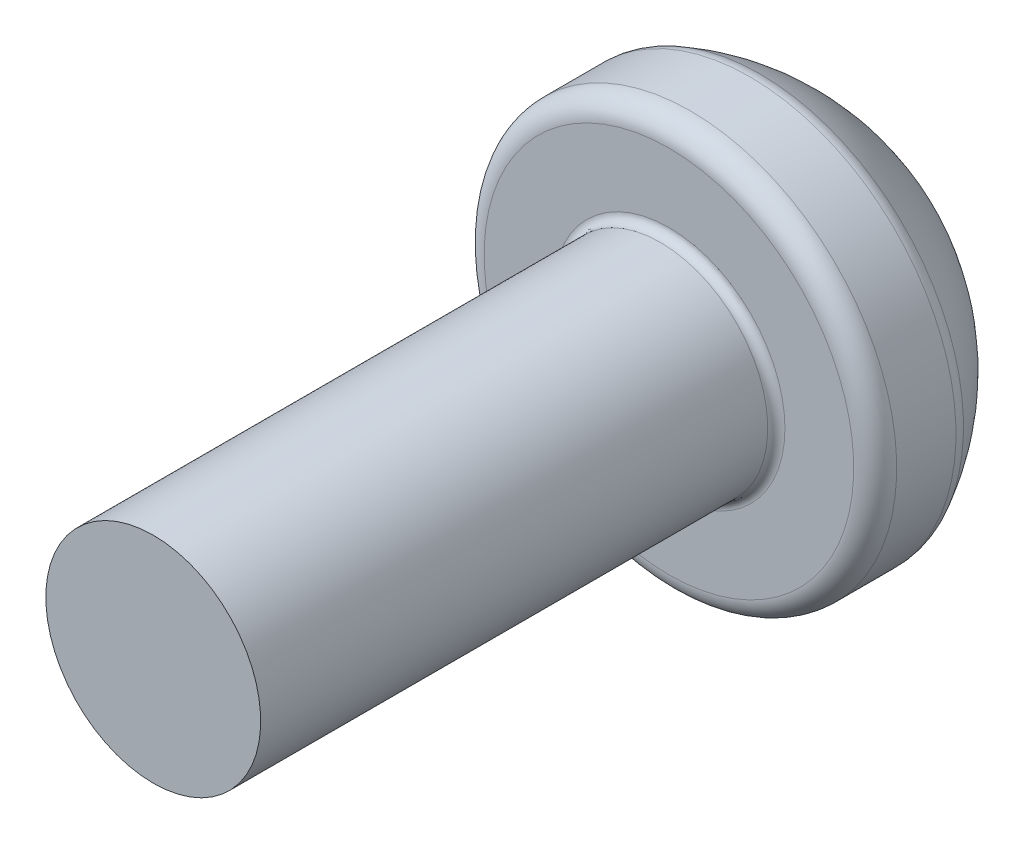
ISO-10303-21;
HEADER;
FILE_DESCRIPTION(('STEP AP214'),'2;1');
FILE_NAME('part.step','',(''),(''),'','','');
FILE_SCHEMA(('AUTOMOTIVE_DESIGN { 1 0 10303 214 1 1 1 1 }'));
ENDSEC;
DATA;
#1=APPLICATION_CONTEXT('core data for automotive mechanical design processes');
#2=APPLICATION_PROTOCOL_DEFINITION('international standard','automotive_design',2000,#1);
#3=PRODUCT_CONTEXT('',#1,'mechanical');
#4=PRODUCT('Part','Part','',(#3));
#5=PRODUCT_RELATED_PRODUCT_CATEGORY('part','',(#4));
#6=PRODUCT_DEFINITION_FORMATION('','',#4);
#7=PRODUCT_DEFINITION_CONTEXT('part definition',#1,'design');
#8=PRODUCT_DEFINITION('design','',#6,#7);
#9=PRODUCT_DEFINITION_SHAPE('','',#8);
#10=(LENGTH_UNIT() NAMED_UNIT(*) SI_UNIT(.MILLI.,.METRE.));
#11=(NAMED_UNIT(*) PLANE_ANGLE_UNIT() SI_UNIT($,.RADIAN.));
#12=(NAMED_UNIT(*) SI_UNIT($,.STERADIAN.) SOLID_ANGLE_UNIT());
#13=UNCERTAINTY_MEASURE_WITH_UNIT(LENGTH_MEASURE(1.E-05),#10,'distance_accuracy_value','');
#14=(GEOMETRIC_REPRESENTATION_CONTEXT(3) GLOBAL_UNCERTAINTY_ASSIGNED_CONTEXT((#13)) GLOBAL_UNIT_ASSIGNED_CONTEXT((#10,
#11,#12)) REPRESENTATION_CONTEXT('',''));
#15=CARTESIAN_POINT('',(0.,0.,0.));
#16=DIRECTION('',(0.,0.,1.));
#17=DIRECTION('',(1.,0.,0.));
#18=AXIS2_PLACEMENT_3D('',#15,#16,#17);
#19=CARTESIAN_POINT('',(0.,0.,6.));
#20=DIRECTION('',(0.,0.,1.));
#21=DIRECTION('',(0.,-1.,0.));
#22=AXIS2_PLACEMENT_3D('',#19,#20,#21);
#23=PLANE('',#22);
#24=CARTESIAN_POINT('',(0.,0.,6.));
#25=DIRECTION('',(0.,0.,-1.));
#26=DIRECTION('',(0.,1.,0.));
#27=AXIS2_PLACEMENT_3D('',#24,#25,#26);
#28=CIRCLE('',#27,1.25);
#29=CARTESIAN_POINT('',(0.,1.25000000000002,6.));
#30=VERTEX_POINT('',#29);
#31=EDGE_CURVE('E265',#30,#30,#28,.T.);
#32=ORIENTED_EDGE('',*,*,#31,.F.);
#33=EDGE_LOOP('',(#32));
#34=FACE_BOUND('',#33,.T.);
#35=ADVANCED_FACE('F34',(#34),#23,.T.);
#36=CARTESIAN_POINT('',(0.,0.,-1.99999999999999));
#37=DIRECTION('',(0.,0.,-1.));
#38=DIRECTION('',(0.,1.,0.));
#39=AXIS2_PLACEMENT_3D('',#36,#37,#38);
#40=CYLINDRICAL_SURFACE('',#39,1.25);
#41=CARTESIAN_POINT('',(0.,0.,0.1));
#42=DIRECTION('',(0.,0.,1.));
#43=DIRECTION('',(0.,-1.,0.));
#44=AXIS2_PLACEMENT_3D('',#41,#42,#43);
#45=CIRCLE('',#44,1.25);
#46=CARTESIAN_POINT('',(0.,-1.25000000000001,0.1));
#47=VERTEX_POINT('',#46);
#48=EDGE_CURVE('E271',#47,#47,#45,.T.);
#49=ORIENTED_EDGE('',*,*,#48,.T.);
#50=EDGE_LOOP('',(#49));
#51=FACE_BOUND('',#50,.T.);
#52=ORIENTED_EDGE('',*,*,#31,.T.);
#53=EDGE_LOOP('',(#52));
#54=FACE_BOUND('',#53,.T.);
#55=ADVANCED_FACE('F309',(#51,#54),#40,.T.);
#56=CARTESIAN_POINT('',(0.,1.25000000000001,0.));
#57=DIRECTION('',(0.,0.,1.));
#58=DIRECTION('',(0.,-1.,0.));
#59=AXIS2_PLACEMENT_3D('',#56,#57,#58);
#60=PLANE('',#59);
#61=CARTESIAN_POINT('',(0.,0.,0.));
#62=DIRECTION('',(0.,0.,1.));
#63=DIRECTION('',(0.,-1.,0.));
#64=AXIS2_PLACEMENT_3D('',#61,#62,#63);
#65=CIRCLE('',#64,2.15);
#66=CARTESIAN_POINT('',(0.,-2.15,0.));
#67=VERTEX_POINT('',#66);
#68=EDGE_CURVE('E11',#67,#67,#65,.T.);
#69=ORIENTED_EDGE('',*,*,#68,.T.);
#70=EDGE_LOOP('',(#69));
#71=FACE_BOUND('',#70,.T.);
#72=CARTESIAN_POINT('',(0.,0.,0.));
#73=DIRECTION('',(0.,0.,1.));
#74=DIRECTION('',(0.,-1.,0.));
#75=AXIS2_PLACEMENT_3D('',#72,#73,#74);
#76=CIRCLE('',#75,1.35);
#77=CARTESIAN_POINT('',(0.,-1.35,0.));
#78=VERTEX_POINT('',#77);
#79=EDGE_CURVE('E268',#78,#78,#76,.F.);
#80=ORIENTED_EDGE('',*,*,#79,.T.);
#81=EDGE_LOOP('',(#80));
#82=FACE_BOUND('',#81,.T.);
#83=ADVANCED_FACE('F315',(#71,#82),#60,.T.);
#84=CARTESIAN_POINT('',(0.,0.,-1.99999999999999));
#85=DIRECTION('',(0.,0.,-1.));
#86=DIRECTION('',(0.,1.,0.));
#87=AXIS2_PLACEMENT_3D('',#84,#85,#86);
#88=CYLINDRICAL_SURFACE('',#87,2.4);
#89=CARTESIAN_POINT('',(0.,0.,-0.939716779629664));
#90=DIRECTION('',(0.,0.,1.));
#91=DIRECTION('',(0.,-1.,0.));
#92=AXIS2_PLACEMENT_3D('',#89,#90,#91);
#93=CIRCLE('',#92,2.4);
#94=CARTESIAN_POINT('',(0.,-2.39999999999999,-0.939716779629664));
#95=VERTEX_POINT('',#94);
#96=EDGE_CURVE('E42',#95,#95,#93,.T.);
#97=ORIENTED_EDGE('',*,*,#96,.T.);
#98=EDGE_LOOP('',(#97));
#99=FACE_BOUND('',#98,.T.);
#100=CARTESIAN_POINT('',(0.,0.,-0.249999999999992));
#101=DIRECTION('',(0.,0.,1.));
#102=DIRECTION('',(0.,-1.,0.));
#103=AXIS2_PLACEMENT_3D('',#100,#101,#102);
#104=CIRCLE('',#103,2.4);
#105=CARTESIAN_POINT('',(0.,-2.4,-0.249999999999992));
#106=VERTEX_POINT('',#105);
#107=EDGE_CURVE('E277',#106,#106,#104,.F.);
#108=ORIENTED_EDGE('',*,*,#107,.T.);
#109=EDGE_LOOP('',(#108));
#110=FACE_BOUND('',#109,.T.);
#111=ADVANCED_FACE('F282',(#99,#110),#88,.T.);
#112=CARTESIAN_POINT('',(0.,0.,0.194199999999998));
#113=DIRECTION('',(0.,0.,-1.));
#114=DIRECTION('',(0.,1.,0.));
#115=AXIS2_PLACEMENT_3D('',#112,#113,#114);
#116=SPHERICAL_SURFACE('',#115,2.68069275374855);
#117=CARTESIAN_POINT('',(0.,0.,-1.05634163666692));
#118=DIRECTION('',(0.,0.,1.));
#119=DIRECTION('',(0.,-1.,0.));
#120=AXIS2_PLACEMENT_3D('',#117,#118,#119);
#121=CIRCLE('',#120,2.37113037493985);
#122=CARTESIAN_POINT('',(0.,2.37113037493985,-1.05634163666692));
#123=VERTEX_POINT('',#122);
#124=EDGE_CURVE('E274',#123,#123,#121,.F.);
#125=CARTESIAN_POINT('',(0.,0.,-1.99999999999999));
#126=DIRECTION('',(0.,0.,-1.));
#127=DIRECTION('',(0.,1.,0.));
#128=AXIS2_PLACEMENT_3D('',#125,#126,#127);
#129=CIRCLE('',#128,1.54);
#130=CARTESIAN_POINT('',(0.,1.54,-1.99999999999999));
#131=VERTEX_POINT('',#130);
#132=EDGE_CURVE('E261',#131,#131,#129,.T.);
#133=CARTESIAN_POINT('',(0.,2.37113037493985,-1.05634163666692));
#134=CARTESIAN_POINT('',(0.,2.36496233821131,-1.06803676094616));
#135=CARTESIAN_POINT('',(0.,2.35870776249117,-1.0796862440655));
#136=CARTESIAN_POINT('',(0.,2.34602693211457,-1.10289139359935));
#137=CARTESIAN_POINT('',(0.,2.33960067745811,-1.11444706001385));
#138=CARTESIAN_POINT('',(0.,2.32657788825569,-1.137462041753));
#139=CARTESIAN_POINT('',(0.,2.31998135370975,-1.14892135707765));
#140=CARTESIAN_POINT('',(0.,2.3066194511287,-1.1717411288514));
#141=CARTESIAN_POINT('',(0.,2.29985408309359,-1.1831015853005));
#142=CARTESIAN_POINT('',(0.,2.28615599420093,-1.20572115170728));
#143=CARTESIAN_POINT('',(0.,2.27922327334336,-1.21698026166495));
#144=CARTESIAN_POINT('',(0.,2.2651919968365,-1.23939467005739));
#145=CARTESIAN_POINT('',(0.,2.25809344118721,-1.25054996849214));
#146=CARTESIAN_POINT('',(0.,2.24373204924237,-1.27275431143024));
#147=CARTESIAN_POINT('',(0.,2.23646921294684,-1.28380335593359));
#148=CARTESIAN_POINT('',(0.,2.22178084987522,-1.30579277189245));
#149=CARTESIAN_POINT('',(0.,2.21435532309914,-1.31673314334796));
#150=CARTESIAN_POINT('',(0.,2.19934320483832,-1.33850281788041));
#151=CARTESIAN_POINT('',(0.,2.19175661335357,-1.34933212095736));
#152=CARTESIAN_POINT('',(0.,2.17642402671519,-1.37087728772175));
#153=CARTESIAN_POINT('',(0.,2.16867803156156,-1.3815931514092));
#154=CARTESIAN_POINT('',(0.,2.15302833352466,-1.40290909322001));
#155=CARTESIAN_POINT('',(0.,2.14512463064139,-1.41350917134337));
#156=CARTESIAN_POINT('',(0.,2.12916124761392,-1.43459122120211));
#157=CARTESIAN_POINT('',(0.,2.12110156746971,-1.44507319293749));
#158=CARTESIAN_POINT('',(0.,2.10482799453926,-1.46591673505503));
#159=CARTESIAN_POINT('',(0.,2.09661410175302,-1.47627830543719));
#160=CARTESIAN_POINT('',(0.,2.08003390192139,-1.49687877624421));
#161=CARTESIAN_POINT('',(0.,2.07166759487599,-1.50711767666908));
#162=CARTESIAN_POINT('',(0.,2.05478439827908,-1.52747056581531));
#163=CARTESIAN_POINT('',(0.,2.04626750872758,-1.53758455453666));
#164=CARTESIAN_POINT('',(0.,2.02908501184067,-1.55768540587833));
#165=CARTESIAN_POINT('',(0.,2.02041940450527,-1.56767226849863));
#166=CARTESIAN_POINT('',(0.,2.00294136933363,-1.58751668107414));
#167=CARTESIAN_POINT('',(0.,1.9941289414974,-1.59737423102935));
#168=CARTESIAN_POINT('',(0.,1.97635919475265,-1.61695786002287));
#169=CARTESIAN_POINT('',(0.,1.96740187584413,-1.62668393906117));
#170=CARTESIAN_POINT('',(0.,1.9493443081064,-1.64600249675386));
#171=CARTESIAN_POINT('',(0.,1.94024405927719,-1.65559497540823));
#172=CARTESIAN_POINT('',(0.,1.92190262414329,-1.67464423211702));
#173=CARTESIAN_POINT('',(0.,1.91266143783862,-1.68410101017144));
#174=CARTESIAN_POINT('',(0.,1.89404015105646,-1.70287679517513));
#175=CARTESIAN_POINT('',(0.,1.88466005057898,-1.71219580212441));
#176=CARTESIAN_POINT('',(0.,1.86576298916831,-1.7306940045768));
#177=CARTESIAN_POINT('',(0.,1.85624602823512,-1.73987320007991));
#178=CARTESIAN_POINT('',(0.,1.83707732959487,-1.7580897699098));
#179=CARTESIAN_POINT('',(0.,1.8274255918878,-1.76712714423657));
#180=CARTESIAN_POINT('',(0.,1.80798945289038,-1.78505809303471));
#181=CARTESIAN_POINT('',(0.,1.79820505160001,-1.79395166750609));
#182=CARTESIAN_POINT('',(0.,1.77850572767181,-1.81159306939759));
#183=CARTESIAN_POINT('',(0.,1.76859080503397,-1.82034089681773));
#184=CARTESIAN_POINT('',(0.,1.74863260922598,-1.8376888893248));
#185=CARTESIAN_POINT('',(0.,1.73858933605584,-1.84628905441173));
#186=CARTESIAN_POINT('',(0.,1.7183766380907,-1.8633398392874));
#187=CARTESIAN_POINT('',(0.,1.70820721329571,-1.87179045907613));
#188=CARTESIAN_POINT('',(0.,1.68774443864321,-1.88854030318034));
#189=CARTESIAN_POINT('',(0.,1.67745108878569,-1.89683952749583));
#190=CARTESIAN_POINT('',(0.,1.65674271757358,-1.91328476344681));
#191=CARTESIAN_POINT('',(0.,1.64632769621899,-1.92143077508231));
#192=CARTESIAN_POINT('',(0.,1.62537826270076,-1.93756780267901));
#193=CARTESIAN_POINT('',(0.,1.61484385053712,-1.94555881864021));
#194=CARTESIAN_POINT('',(0.,1.59365794042496,-1.96138410333854));
#195=CARTESIAN_POINT('',(0.,1.58300644247643,-1.96921837207567));
#196=CARTESIAN_POINT('',(0.,1.56158869818568,-1.98472845439087));
#197=CARTESIAN_POINT('',(0.,1.55082245184346,-1.99240426796895));
#198=CARTESIAN_POINT('',(0.,1.54,-1.99999999999999));
#199=B_SPLINE_CURVE_WITH_KNOTS('',3,(#133,#134,#135,#136,#137,#138,#139,#140,#141,#142,#143,
#144,#145,#146,#147,#148,#149,#150,#151,#152,#153,#154,#155,#156,#157,#158,#159,#160,#161,#162,
#163,#164,#165,#166,#167,#168,#169,#170,#171,#172,#173,#174,#175,#176,#177,#178,#179,#180,#181,
#182,#183,#184,#185,#186,#187,#188,#189,#190,#191,#192,#193,#194,#195,#196,#197,#198),
.UNSPECIFIED.,.F.,.F.,(4,2,2,2,2,2,2,2,2,2,2,2,2,2,2,2,2,2,2,2,2,2,2,2,2,2,2,2,2,2,2,2,4),(0.,
0.0396655612265228,0.0793311224530455,0.118996683679568,0.158662244906091,0.198327806132614,
0.237993367359137,0.277658928585659,0.317324489812182,0.356990051038705,0.396655612265228,
0.43632117349175,0.475986734718273,0.515652295944796,0.555317857171319,0.594983418397842,
0.634648979624364,0.674314540850887,0.71398010207741,0.753645663303933,0.793311224530455,
0.832976785756978,0.872642346983501,0.912307908210024,0.951973469436547,0.991639030663069,
1.03130459188959,1.07097015311612,1.11063571434264,1.15030127556916,1.18996683679568,
1.22963239802221,1.26929795924873),.UNSPECIFIED.);
#200=EDGE_CURVE('BSEAM291',#123,#131,#199,.T.);
#201=ORIENTED_EDGE('',*,*,#124,.T.);
#202=ORIENTED_EDGE('',*,*,#132,.F.);
#203=ORIENTED_EDGE('',*,*,#200,.T.);
#204=ORIENTED_EDGE('',*,*,#200,.F.);
#205=EDGE_LOOP('',(#201,#203,#202,#204));
#206=FACE_BOUND('',#205,.T.);
#207=ADVANCED_FACE('F291',(#206),#116,.T.);
#208=CARTESIAN_POINT('',(0.,0.,-1.99999999999999));
#209=DIRECTION('',(0.,0.,-1.));
#210=DIRECTION('',(0.,1.,0.));
#211=AXIS2_PLACEMENT_3D('',#208,#209,#210);
#212=PLANE('',#211);
#213=CARTESIAN_POINT('',(0.,0.,-1.99999999999999));
#214=DIRECTION('',(0.,0.,-1.));
#215=DIRECTION('',(0.,1.,0.));
#216=AXIS2_PLACEMENT_3D('',#213,#214,#215);
#217=CIRCLE('',#216,1.4);
#218=CARTESIAN_POINT('',(0.217707917147314,-1.38296900283822,-2.));
#219=VERTEX_POINT('',#218);
#220=CARTESIAN_POINT('',(-0.217707917147369,-1.38296900283822,-1.99999999999999));
#221=VERTEX_POINT('',#220);
#222=EDGE_CURVE('E220',#219,#221,#217,.T.);
#223=ORIENTED_EDGE('',*,*,#222,.F.);
#224=CARTESIAN_POINT('',(0.807499999999954,-1.39863102711187,-1.99999999999999));
#225=DIRECTION('',(0.,0.,1.));
#226=DIRECTION('',(0.,1.,0.));
#227=AXIS2_PLACEMENT_3D('',#224,#225,#226);
#228=CIRCLE('',#227,0.59);
#229=CARTESIAN_POINT('',(1.08883233053058,-0.880025088273745,-2.));
#230=VERTEX_POINT('',#229);
#231=EDGE_CURVE('E218',#230,#219,#228,.T.);
#232=ORIENTED_EDGE('',*,*,#231,.F.);
#233=CARTESIAN_POINT('',(0.,0.,-1.99999999999999));
#234=DIRECTION('',(0.,0.,-1.));
#235=DIRECTION('',(0.,1.,0.));
#236=AXIS2_PLACEMENT_3D('',#233,#234,#235);
#237=CIRCLE('',#236,1.4);
#238=CARTESIAN_POINT('',(1.30654024767795,-0.50294391456452,-1.99999999999999));
#239=VERTEX_POINT('',#238);
#240=EDGE_CURVE('E215',#239,#230,#237,.T.);
#241=ORIENTED_EDGE('',*,*,#240,.F.);
#242=CARTESIAN_POINT('',(1.61499999999998,0.,-1.99999999999999));
#243=DIRECTION('',(0.,0.,1.));
#244=DIRECTION('',(0.,1.,0.));
#245=AXIS2_PLACEMENT_3D('',#242,#243,#244);
#246=CIRCLE('',#245,0.59);
#247=CARTESIAN_POINT('',(1.30654024767796,0.502943914564482,-1.99999999999999));
#248=VERTEX_POINT('',#247);
#249=EDGE_CURVE('E213',#248,#239,#246,.T.);
#250=ORIENTED_EDGE('',*,*,#249,.F.);
#251=CARTESIAN_POINT('',(0.,0.,-1.99999999999999));
#252=DIRECTION('',(0.,0.,-1.));
#253=DIRECTION('',(0.,1.,0.));
#254=AXIS2_PLACEMENT_3D('',#251,#252,#253);
#255=CIRCLE('',#254,1.4);
#256=CARTESIAN_POINT('',(1.08883233053061,0.880025088273728,-2.));
#257=VERTEX_POINT('',#256);
#258=EDGE_CURVE('E210',#257,#248,#255,.T.);
#259=ORIENTED_EDGE('',*,*,#258,.F.);
#260=CARTESIAN_POINT('',(0.807499999999975,1.39863102711188,-2.));
#261=DIRECTION('',(0.,0.,1.));
#262=DIRECTION('',(0.,1.,0.));
#263=AXIS2_PLACEMENT_3D('',#260,#261,#262);
#264=CIRCLE('',#263,0.59);
#265=CARTESIAN_POINT('',(0.217707917147307,1.38296900283823,-2.));
#266=VERTEX_POINT('',#265);
#267=EDGE_CURVE('E208',#266,#257,#264,.T.);
#268=ORIENTED_EDGE('',*,*,#267,.F.);
#269=CARTESIAN_POINT('',(0.,0.,-1.99999999999999));
#270=DIRECTION('',(0.,0.,-1.));
#271=DIRECTION('',(0.,1.,0.));
#272=AXIS2_PLACEMENT_3D('',#269,#270,#271);
#273=CIRCLE('',#272,1.4);
#274=CARTESIAN_POINT('',(-0.21770791714739,1.38296900283822,-2.));
#275=VERTEX_POINT('',#274);
#276=EDGE_CURVE('E205',#275,#266,#273,.T.);
#277=ORIENTED_EDGE('',*,*,#276,.F.);
#278=CARTESIAN_POINT('',(-0.8075000000001,1.39863102711186,-2.));
#279=DIRECTION('',(0.,0.,1.));
#280=DIRECTION('',(0.,1.,0.));
#281=AXIS2_PLACEMENT_3D('',#278,#279,#280);
#282=CIRCLE('',#281,0.59);
#283=CARTESIAN_POINT('',(-1.08883233053075,0.880025088273707,-2.));
#284=VERTEX_POINT('',#283);
#285=EDGE_CURVE('E203',#284,#275,#282,.T.);
#286=ORIENTED_EDGE('',*,*,#285,.F.);
#287=CARTESIAN_POINT('',(0.,0.,-1.99999999999999));
#288=DIRECTION('',(0.,0.,-1.));
#289=DIRECTION('',(0.,1.,0.));
#290=AXIS2_PLACEMENT_3D('',#287,#288,#289);
#291=CIRCLE('',#290,1.4);
#292=CARTESIAN_POINT('',(-1.30654024767803,0.502943914564503,-2.));
#293=VERTEX_POINT('',#292);
#294=EDGE_CURVE('E201',#293,#284,#291,.T.);
#295=ORIENTED_EDGE('',*,*,#294,.F.);
#296=CARTESIAN_POINT('',(-1.61500000000011,0.,-2.));
#297=DIRECTION('',(0.,0.,1.));
#298=DIRECTION('',(0.,1.,0.));
#299=AXIS2_PLACEMENT_3D('',#296,#297,#298);
#300=CIRCLE('',#299,0.59);
#301=CARTESIAN_POINT('',(-1.30654024767804,-0.502943914564499,-1.99999999999999));
#302=VERTEX_POINT('',#301);
#303=EDGE_CURVE('E161',#302,#293,#300,.T.);
#304=ORIENTED_EDGE('',*,*,#303,.F.);
#305=CARTESIAN_POINT('',(0.,0.,-1.99999999999999));
#306=DIRECTION('',(0.,0.,-1.));
#307=DIRECTION('',(0.,1.,0.));
#308=AXIS2_PLACEMENT_3D('',#305,#306,#307);
#309=CIRCLE('',#308,1.4);
#310=CARTESIAN_POINT('',(-1.08883233053067,-0.880025088273732,-1.99999999999999));
#311=VERTEX_POINT('',#310);
#312=EDGE_CURVE('E157',#311,#302,#309,.T.);
#313=ORIENTED_EDGE('',*,*,#312,.F.);
#314=CARTESIAN_POINT('',(-0.807500000000044,-1.39863102711187,-2.));
#315=DIRECTION('',(0.,0.,1.));
#316=DIRECTION('',(0.,1.,0.));
#317=AXIS2_PLACEMENT_3D('',#314,#315,#316);
#318=CIRCLE('',#317,0.59);
#319=EDGE_CURVE('E223',#221,#311,#318,.T.);
#320=ORIENTED_EDGE('',*,*,#319,.F.);
#321=EDGE_LOOP('',(#223,#232,#241,#250,#259,#268,#277,#286,#295,#304,#313,#320));
#322=FACE_BOUND('',#321,.T.);
#323=ORIENTED_EDGE('',*,*,#132,.T.);
#324=EDGE_LOOP('',(#323));
#325=FACE_BOUND('',#324,.T.);
#326=ADVANCED_FACE('F294',(#322,#325),#212,.T.);
#327=CARTESIAN_POINT('',(0.,0.,0.1));
#328=DIRECTION('',(0.,0.,1.));
#329=DIRECTION('',(0.,-1.,0.));
#330=AXIS2_PLACEMENT_3D('',#327,#328,#329);
#331=TOROIDAL_SURFACE('',#330,1.35,0.1);
#332=ORIENTED_EDGE('',*,*,#48,.F.);
#333=EDGE_LOOP('',(#332));
#334=FACE_BOUND('',#333,.T.);
#335=ORIENTED_EDGE('',*,*,#79,.F.);
#336=EDGE_LOOP('',(#335));
#337=FACE_BOUND('',#336,.T.);
#338=ADVANCED_FACE('F288',(#334,#337),#331,.F.);
#339=CARTESIAN_POINT('',(0.,0.,-0.939716779629664));
#340=DIRECTION('',(0.,0.,1.));
#341=DIRECTION('',(0.,-1.,0.));
#342=AXIS2_PLACEMENT_3D('',#339,#340,#341);
#343=TOROIDAL_SURFACE('',#342,2.15,0.25);
#344=ORIENTED_EDGE('',*,*,#96,.F.);
#345=EDGE_LOOP('',(#344));
#346=FACE_BOUND('',#345,.T.);
#347=ORIENTED_EDGE('',*,*,#124,.F.);
#348=EDGE_LOOP('',(#347));
#349=FACE_BOUND('',#348,.T.);
#350=ADVANCED_FACE('F285',(#346,#349),#343,.T.);
#351=CARTESIAN_POINT('',(0.,0.,-0.249999999999992));
#352=DIRECTION('',(0.,0.,1.));
#353=DIRECTION('',(0.,-1.,0.));
#354=AXIS2_PLACEMENT_3D('',#351,#352,#353);
#355=TOROIDAL_SURFACE('',#354,2.15,0.25);
#356=ORIENTED_EDGE('',*,*,#68,.F.);
#357=EDGE_LOOP('',(#356));
#358=FACE_BOUND('',#357,.T.);
#359=ORIENTED_EDGE('',*,*,#107,.F.);
#360=EDGE_LOOP('',(#359));
#361=FACE_BOUND('',#360,.T.);
#362=ADVANCED_FACE('F36',(#358,#361),#355,.T.);
#363=CARTESIAN_POINT('',(-1.61500000000011,0.,-1.));
#364=DIRECTION('',(0.,0.,-1.));
#365=DIRECTION('',(0.,1.,0.));
#366=AXIS2_PLACEMENT_3D('',#363,#364,#365);
#367=CYLINDRICAL_SURFACE('',#366,0.59);
#368=CARTESIAN_POINT('',(-1.61500000000011,0.,-1.));
#369=DIRECTION('',(0.,0.,1.));
#370=DIRECTION('',(0.,1.,0.));
#371=AXIS2_PLACEMENT_3D('',#368,#369,#370);
#372=CIRCLE('',#371,0.59);
#373=CARTESIAN_POINT('',(-1.30654024767803,-0.502943914564503,-0.999999999999993));
#374=VERTEX_POINT('',#373);
#375=CARTESIAN_POINT('',(-1.025,0.,-0.999999999999993));
#376=VERTEX_POINT('',#375);
#377=EDGE_CURVE('E156',#374,#376,#372,.T.);
#378=ORIENTED_EDGE('',*,*,#377,.F.);
#379=DIRECTION('',(0.,0.,-1.));
#380=VECTOR('',#379,1.);
#381=CARTESIAN_POINT('',(-1.30654024767803,-0.502943914564503,-0.999999999999993));
#382=LINE('',#381,#380);
#383=EDGE_CURVE('E227',#374,#302,#382,.T.);
#384=ORIENTED_EDGE('',*,*,#383,.T.);
#385=ORIENTED_EDGE('',*,*,#303,.T.);
#386=DIRECTION('',(0.,0.,-1.));
#387=VECTOR('',#386,1.);
#388=CARTESIAN_POINT('',(-1.30654024767807,0.502943914564492,-1.));
#389=LINE('',#388,#387);
#390=CARTESIAN_POINT('',(-1.30654024767807,0.502943914564492,-1.));
#391=VERTEX_POINT('',#390);
#392=EDGE_CURVE('E49',#391,#293,#389,.T.);
#393=ORIENTED_EDGE('',*,*,#392,.F.);
#394=EDGE_CURVE('E147',#376,#391,#372,.T.);
#395=ORIENTED_EDGE('',*,*,#394,.F.);
#396=EDGE_LOOP('',(#378,#384,#385,#393,#395));
#397=FACE_BOUND('',#396,.T.);
#398=ADVANCED_FACE('F159',(#397),#367,.T.);
#399=CARTESIAN_POINT('',(-0.807500000000093,-1.39863102711188,-0.999999999999995));
#400=DIRECTION('',(0.,0.,-1.));
#401=DIRECTION('',(0.,1.,0.));
#402=AXIS2_PLACEMENT_3D('',#399,#400,#401);
#403=CYLINDRICAL_SURFACE('',#402,0.59);
#404=CARTESIAN_POINT('',(-0.807500000000093,-1.39863102711188,-0.999999999999995));
#405=DIRECTION('',(0.,0.,1.));
#406=DIRECTION('',(0.,1.,0.));
#407=AXIS2_PLACEMENT_3D('',#404,#405,#406);
#408=CIRCLE('',#407,0.59);
#409=CARTESIAN_POINT('',(-0.217707917147369,-1.38296900283823,-1.));
#410=VERTEX_POINT('',#409);
#411=CARTESIAN_POINT('',(-0.512500000000068,-0.887676038879067,-0.999999999999993));
#412=VERTEX_POINT('',#411);
#413=EDGE_CURVE('E195',#410,#412,#408,.T.);
#414=ORIENTED_EDGE('',*,*,#413,.F.);
#415=DIRECTION('',(0.,0.,-1.));
#416=VECTOR('',#415,1.);
#417=CARTESIAN_POINT('',(-0.217707917147369,-1.38296900283823,-1.));
#418=LINE('',#417,#416);
#419=EDGE_CURVE('E233',#410,#221,#418,.T.);
#420=ORIENTED_EDGE('',*,*,#419,.T.);
#421=ORIENTED_EDGE('',*,*,#319,.T.);
#422=DIRECTION('',(0.,0.,-1.));
#423=VECTOR('',#422,1.);
#424=CARTESIAN_POINT('',(-1.08883233053066,-0.880025088273732,-0.999999999999993));
#425=LINE('',#424,#423);
#426=CARTESIAN_POINT('',(-1.08883233053066,-0.880025088273732,-0.999999999999993));
#427=VERTEX_POINT('',#426);
#428=EDGE_CURVE('E230',#427,#311,#425,.T.);
#429=ORIENTED_EDGE('',*,*,#428,.F.);
#430=EDGE_CURVE('E194',#412,#427,#408,.T.);
#431=ORIENTED_EDGE('',*,*,#430,.F.);
#432=EDGE_LOOP('',(#414,#420,#421,#429,#431));
#433=FACE_BOUND('',#432,.T.);
#434=ADVANCED_FACE('F363',(#433),#403,.T.);
#435=CARTESIAN_POINT('',(0.80749999999994,-1.39863102711189,-0.999999999999993));
#436=DIRECTION('',(0.,0.,-1.));
#437=DIRECTION('',(0.,1.,0.));
#438=AXIS2_PLACEMENT_3D('',#435,#436,#437);
#439=CYLINDRICAL_SURFACE('',#438,0.59);
#440=CARTESIAN_POINT('',(0.80749999999994,-1.39863102711189,-0.999999999999993));
#441=DIRECTION('',(0.,0.,1.));
#442=DIRECTION('',(0.,1.,0.));
#443=AXIS2_PLACEMENT_3D('',#440,#441,#442);
#444=CIRCLE('',#443,0.59);
#445=CARTESIAN_POINT('',(1.08883233053058,-0.880025088273752,-1.));
#446=VERTEX_POINT('',#445);
#447=CARTESIAN_POINT('',(0.512499999999992,-0.88767603887906,-0.999999999999993));
#448=VERTEX_POINT('',#447);
#449=EDGE_CURVE('E188',#446,#448,#444,.T.);
#450=ORIENTED_EDGE('',*,*,#449,.F.);
#451=DIRECTION('',(0.,0.,-1.));
#452=VECTOR('',#451,1.);
#453=CARTESIAN_POINT('',(1.08883233053058,-0.880025088273752,-1.));
#454=LINE('',#453,#452);
#455=EDGE_CURVE('E239',#446,#230,#454,.T.);
#456=ORIENTED_EDGE('',*,*,#455,.T.);
#457=ORIENTED_EDGE('',*,*,#231,.T.);
#458=DIRECTION('',(0.,0.,-1.));
#459=VECTOR('',#458,1.);
#460=CARTESIAN_POINT('',(0.217707917147307,-1.38296900283823,-0.999999999999995));
#461=LINE('',#460,#459);
#462=CARTESIAN_POINT('',(0.217707917147307,-1.38296900283823,-0.999999999999995));
#463=VERTEX_POINT('',#462);
#464=EDGE_CURVE('E236',#463,#219,#461,.T.);
#465=ORIENTED_EDGE('',*,*,#464,.F.);
#466=EDGE_CURVE('E187',#448,#463,#444,.T.);
#467=ORIENTED_EDGE('',*,*,#466,.F.);
#468=EDGE_LOOP('',(#450,#456,#457,#465,#467));
#469=FACE_BOUND('',#468,.T.);
#470=ADVANCED_FACE('F370',(#469),#439,.T.);
#471=CARTESIAN_POINT('',(1.61499999999996,0.,-0.999999999999993));
#472=DIRECTION('',(0.,0.,-1.));
#473=DIRECTION('',(0.,1.,0.));
#474=AXIS2_PLACEMENT_3D('',#471,#472,#473);
#475=CYLINDRICAL_SURFACE('',#474,0.59);
#476=CARTESIAN_POINT('',(1.61499999999996,0.,-0.999999999999993));
#477=DIRECTION('',(0.,0.,1.));
#478=DIRECTION('',(0.,1.,0.));
#479=AXIS2_PLACEMENT_3D('',#476,#477,#478);
#480=CIRCLE('',#479,0.59);
#481=CARTESIAN_POINT('',(1.30654024767801,0.502943914564492,-0.999999999999993));
#482=VERTEX_POINT('',#481);
#483=CARTESIAN_POINT('',(1.02499999999998,0.,-0.999999999999993));
#484=VERTEX_POINT('',#483);
#485=EDGE_CURVE('E181',#482,#484,#480,.T.);
#486=ORIENTED_EDGE('',*,*,#485,.F.);
#487=DIRECTION('',(0.,0.,-1.));
#488=VECTOR('',#487,1.);
#489=CARTESIAN_POINT('',(1.30654024767801,0.502943914564492,-0.999999999999993));
#490=LINE('',#489,#488);
#491=EDGE_CURVE('E245',#482,#248,#490,.T.);
#492=ORIENTED_EDGE('',*,*,#491,.T.);
#493=ORIENTED_EDGE('',*,*,#249,.T.);
#494=DIRECTION('',(0.,0.,-1.));
#495=VECTOR('',#494,1.);
#496=CARTESIAN_POINT('',(1.30654024767796,-0.502943914564524,-0.999999999999993));
#497=LINE('',#496,#495);
#498=CARTESIAN_POINT('',(1.30654024767796,-0.502943914564524,-0.999999999999993));
#499=VERTEX_POINT('',#498);
#500=EDGE_CURVE('E242',#499,#239,#497,.T.);
#501=ORIENTED_EDGE('',*,*,#500,.F.);
#502=EDGE_CURVE('E180',#484,#499,#480,.T.);
#503=ORIENTED_EDGE('',*,*,#502,.F.);
#504=EDGE_LOOP('',(#486,#492,#493,#501,#503));
#505=FACE_BOUND('',#504,.T.);
#506=ADVANCED_FACE('F378',(#505),#475,.T.);
#507=CARTESIAN_POINT('',(0.807499999999989,1.39863102711188,-1.00000000000001));
#508=DIRECTION('',(0.,0.,-1.));
#509=DIRECTION('',(0.,1.,0.));
#510=AXIS2_PLACEMENT_3D('',#507,#508,#509);
#511=CYLINDRICAL_SURFACE('',#510,0.59);
#512=CARTESIAN_POINT('',(0.807499999999989,1.39863102711188,-1.00000000000001));
#513=DIRECTION('',(0.,0.,1.));
#514=DIRECTION('',(0.,1.,0.));
#515=AXIS2_PLACEMENT_3D('',#512,#513,#514);
#516=CIRCLE('',#515,0.59);
#517=CARTESIAN_POINT('',(0.217707917147342,1.38296900283823,-1.));
#518=VERTEX_POINT('',#517);
#519=CARTESIAN_POINT('',(0.512499999999978,0.88767603887905,-1.));
#520=VERTEX_POINT('',#519);
#521=EDGE_CURVE('E57',#518,#520,#516,.T.);
#522=ORIENTED_EDGE('',*,*,#521,.F.);
#523=DIRECTION('',(0.,0.,-1.));
#524=VECTOR('',#523,1.);
#525=CARTESIAN_POINT('',(0.217707917147342,1.38296900283823,-1.));
#526=LINE('',#525,#524);
#527=EDGE_CURVE('E251',#518,#266,#526,.T.);
#528=ORIENTED_EDGE('',*,*,#527,.T.);
#529=ORIENTED_EDGE('',*,*,#267,.T.);
#530=DIRECTION('',(0.,0.,-1.));
#531=VECTOR('',#530,1.);
#532=CARTESIAN_POINT('',(1.08883233053061,0.880025088273714,-1.));
#533=LINE('',#532,#531);
#534=CARTESIAN_POINT('',(1.08883233053061,0.880025088273714,-1.));
#535=VERTEX_POINT('',#534);
#536=EDGE_CURVE('E248',#535,#257,#533,.T.);
#537=ORIENTED_EDGE('',*,*,#536,.F.);
#538=EDGE_CURVE('E175',#520,#535,#516,.T.);
#539=ORIENTED_EDGE('',*,*,#538,.F.);
#540=EDGE_LOOP('',(#522,#528,#529,#537,#539));
#541=FACE_BOUND('',#540,.T.);
#542=ADVANCED_FACE('F386',(#541),#511,.T.);
#543=CARTESIAN_POINT('',(-0.807500000000134,1.39863102711184,-1.));
#544=DIRECTION('',(0.,0.,-1.));
#545=DIRECTION('',(0.,1.,0.));
#546=AXIS2_PLACEMENT_3D('',#543,#544,#545);
#547=CYLINDRICAL_SURFACE('',#546,0.59);
#548=CARTESIAN_POINT('',(-0.807500000000134,1.39863102711184,-1.));
#549=DIRECTION('',(0.,0.,1.));
#550=DIRECTION('',(0.,1.,0.));
#551=AXIS2_PLACEMENT_3D('',#548,#549,#550);
#552=CIRCLE('',#551,0.59);
#553=CARTESIAN_POINT('',(-1.08883233053073,0.880025088273707,-0.999999999999998));
#554=VERTEX_POINT('',#553);
#555=CARTESIAN_POINT('',(-0.512500000000089,0.887676038879032,-1.));
#556=VERTEX_POINT('',#555);
#557=EDGE_CURVE('E170',#554,#556,#552,.T.);
#558=ORIENTED_EDGE('',*,*,#557,.F.);
#559=DIRECTION('',(0.,0.,-1.));
#560=VECTOR('',#559,1.);
#561=CARTESIAN_POINT('',(-1.08883233053073,0.880025088273707,-0.999999999999998));
#562=LINE('',#561,#560);
#563=EDGE_CURVE('E163',#554,#284,#562,.T.);
#564=ORIENTED_EDGE('',*,*,#563,.T.);
#565=ORIENTED_EDGE('',*,*,#285,.T.);
#566=DIRECTION('',(0.,0.,-1.));
#567=VECTOR('',#566,1.);
#568=CARTESIAN_POINT('',(-0.21770791714739,1.38296900283822,-1.));
#569=LINE('',#568,#567);
#570=CARTESIAN_POINT('',(-0.21770791714739,1.38296900283822,-1.));
#571=VERTEX_POINT('',#570);
#572=EDGE_CURVE('E254',#571,#275,#569,.T.);
#573=ORIENTED_EDGE('',*,*,#572,.F.);
#574=EDGE_CURVE('E168',#556,#571,#552,.T.);
#575=ORIENTED_EDGE('',*,*,#574,.F.);
#576=EDGE_LOOP('',(#558,#564,#565,#573,#575));
#577=FACE_BOUND('',#576,.T.);
#578=ADVANCED_FACE('F394',(#577),#547,.T.);
#579=CARTESIAN_POINT('',(-0.807500000000065,0.,-0.999999999999998));
#580=DIRECTION('',(0.,0.,-1.));
#581=DIRECTION('',(0.,1.,0.));
#582=AXIS2_PLACEMENT_3D('',#579,#580,#581);
#583=PLANE('',#582);
#584=CARTESIAN_POINT('',(0.,0.,-0.999999999999993));
#585=DIRECTION('',(0.,0.,-1.));
#586=DIRECTION('',(0.,1.,0.));
#587=AXIS2_PLACEMENT_3D('',#584,#585,#586);
#588=CIRCLE('',#587,1.025);
#589=EDGE_CURVE('E152',#376,#556,#588,.T.);
#590=ORIENTED_EDGE('',*,*,#589,.F.);
#591=ORIENTED_EDGE('',*,*,#394,.T.);
#592=CARTESIAN_POINT('',(0.,0.,-0.999999999999993));
#593=DIRECTION('',(0.,0.,-1.));
#594=DIRECTION('',(0.,1.,0.));
#595=AXIS2_PLACEMENT_3D('',#592,#593,#594);
#596=CIRCLE('',#595,1.4);
#597=EDGE_CURVE('E150',#391,#554,#596,.T.);
#598=ORIENTED_EDGE('',*,*,#597,.T.);
#599=ORIENTED_EDGE('',*,*,#557,.T.);
#600=EDGE_LOOP('',(#590,#591,#598,#599));
#601=FACE_BOUND('',#600,.T.);
#602=ADVANCED_FACE('F148',(#601),#583,.T.);
#603=EDGE_CURVE('E516',#412,#376,#588,.T.);
#604=ORIENTED_EDGE('',*,*,#603,.F.);
#605=ORIENTED_EDGE('',*,*,#430,.T.);
#606=CARTESIAN_POINT('',(0.,0.,-0.999999999999993));
#607=DIRECTION('',(0.,0.,-1.));
#608=DIRECTION('',(0.,1.,0.));
#609=AXIS2_PLACEMENT_3D('',#606,#607,#608);
#610=CIRCLE('',#609,1.4);
#611=EDGE_CURVE('E164',#427,#374,#610,.T.);
#612=ORIENTED_EDGE('',*,*,#611,.T.);
#613=ORIENTED_EDGE('',*,*,#377,.T.);
#614=EDGE_LOOP('',(#604,#605,#612,#613));
#615=FACE_BOUND('',#614,.T.);
#616=ADVANCED_FACE('F409',(#615),#583,.T.);
#617=EDGE_CURVE('E517',#448,#412,#588,.T.);
#618=ORIENTED_EDGE('',*,*,#617,.F.);
#619=ORIENTED_EDGE('',*,*,#466,.T.);
#620=CARTESIAN_POINT('',(0.,0.,-0.999999999999993));
#621=DIRECTION('',(0.,0.,-1.));
#622=DIRECTION('',(0.,1.,0.));
#623=AXIS2_PLACEMENT_3D('',#620,#621,#622);
#624=CIRCLE('',#623,1.4);
#625=EDGE_CURVE('E191',#463,#410,#624,.T.);
#626=ORIENTED_EDGE('',*,*,#625,.T.);
#627=ORIENTED_EDGE('',*,*,#413,.T.);
#628=EDGE_LOOP('',(#618,#619,#626,#627));
#629=FACE_BOUND('',#628,.T.);
#630=ADVANCED_FACE('F417',(#629),#583,.T.);
#631=EDGE_CURVE('E262',#484,#448,#588,.T.);
#632=ORIENTED_EDGE('',*,*,#631,.F.);
#633=ORIENTED_EDGE('',*,*,#502,.T.);
#634=CARTESIAN_POINT('',(0.,0.,-0.999999999999993));
#635=DIRECTION('',(0.,0.,-1.));
#636=DIRECTION('',(0.,1.,0.));
#637=AXIS2_PLACEMENT_3D('',#634,#635,#636);
#638=CIRCLE('',#637,1.4);
#639=EDGE_CURVE('E184',#499,#446,#638,.T.);
#640=ORIENTED_EDGE('',*,*,#639,.T.);
#641=ORIENTED_EDGE('',*,*,#449,.T.);
#642=EDGE_LOOP('',(#632,#633,#640,#641));
#643=FACE_BOUND('',#642,.T.);
#644=ADVANCED_FACE('F424',(#643),#583,.T.);
#645=EDGE_CURVE('E258',#520,#484,#588,.T.);
#646=ORIENTED_EDGE('',*,*,#645,.F.);
#647=ORIENTED_EDGE('',*,*,#538,.T.);
#648=CARTESIAN_POINT('',(0.,0.,-0.999999999999993));
#649=DIRECTION('',(0.,0.,-1.));
#650=DIRECTION('',(0.,1.,0.));
#651=AXIS2_PLACEMENT_3D('',#648,#649,#650);
#652=CIRCLE('',#651,1.4);
#653=EDGE_CURVE('E177',#535,#482,#652,.T.);
#654=ORIENTED_EDGE('',*,*,#653,.T.);
#655=ORIENTED_EDGE('',*,*,#485,.T.);
#656=EDGE_LOOP('',(#646,#647,#654,#655));
#657=FACE_BOUND('',#656,.T.);
#658=ADVANCED_FACE('F431',(#657),#583,.T.);
#659=EDGE_CURVE('E229',#556,#520,#588,.T.);
#660=ORIENTED_EDGE('',*,*,#659,.F.);
#661=ORIENTED_EDGE('',*,*,#574,.T.);
#662=CARTESIAN_POINT('',(0.,0.,-0.999999999999993));
#663=DIRECTION('',(0.,0.,-1.));
#664=DIRECTION('',(0.,1.,0.));
#665=AXIS2_PLACEMENT_3D('',#662,#663,#664);
#666=CIRCLE('',#665,1.4);
#667=EDGE_CURVE('E173',#571,#518,#666,.T.);
#668=ORIENTED_EDGE('',*,*,#667,.T.);
#669=ORIENTED_EDGE('',*,*,#521,.T.);
#670=EDGE_LOOP('',(#660,#661,#668,#669));
#671=FACE_BOUND('',#670,.T.);
#672=ADVANCED_FACE('F411',(#671),#583,.T.);
#673=CARTESIAN_POINT('',(0.,0.,-0.999999999999993));
#674=DIRECTION('',(0.,0.,-1.));
#675=DIRECTION('',(0.,1.,0.));
#676=AXIS2_PLACEMENT_3D('',#673,#674,#675);
#677=CYLINDRICAL_SURFACE('',#676,1.4);
#678=ORIENTED_EDGE('',*,*,#312,.T.);
#679=ORIENTED_EDGE('',*,*,#383,.F.);
#680=ORIENTED_EDGE('',*,*,#611,.F.);
#681=ORIENTED_EDGE('',*,*,#428,.T.);
#682=EDGE_LOOP('',(#678,#679,#680,#681));
#683=FACE_BOUND('',#682,.T.);
#684=ADVANCED_FACE('F444',(#683),#677,.F.);
#685=CARTESIAN_POINT('',(0.,0.,-0.999999999999993));
#686=DIRECTION('',(0.,0.,-1.));
#687=DIRECTION('',(0.,1.,0.));
#688=AXIS2_PLACEMENT_3D('',#685,#686,#687);
#689=CYLINDRICAL_SURFACE('',#688,1.4);
#690=ORIENTED_EDGE('',*,*,#222,.T.);
#691=ORIENTED_EDGE('',*,*,#419,.F.);
#692=ORIENTED_EDGE('',*,*,#625,.F.);
#693=ORIENTED_EDGE('',*,*,#464,.T.);
#694=EDGE_LOOP('',(#690,#691,#692,#693));
#695=FACE_BOUND('',#694,.T.);
#696=ADVANCED_FACE('F450',(#695),#689,.F.);
#697=CARTESIAN_POINT('',(0.,0.,-0.999999999999993));
#698=DIRECTION('',(0.,0.,-1.));
#699=DIRECTION('',(0.,1.,0.));
#700=AXIS2_PLACEMENT_3D('',#697,#698,#699);
#701=CYLINDRICAL_SURFACE('',#700,1.4);
#702=ORIENTED_EDGE('',*,*,#240,.T.);
#703=ORIENTED_EDGE('',*,*,#455,.F.);
#704=ORIENTED_EDGE('',*,*,#639,.F.);
#705=ORIENTED_EDGE('',*,*,#500,.T.);
#706=EDGE_LOOP('',(#702,#703,#704,#705));
#707=FACE_BOUND('',#706,.T.);
#708=ADVANCED_FACE('F458',(#707),#701,.F.);
#709=CARTESIAN_POINT('',(0.,0.,-0.999999999999993));
#710=DIRECTION('',(0.,0.,-1.));
#711=DIRECTION('',(0.,1.,0.));
#712=AXIS2_PLACEMENT_3D('',#709,#710,#711);
#713=CYLINDRICAL_SURFACE('',#712,1.4);
#714=ORIENTED_EDGE('',*,*,#258,.T.);
#715=ORIENTED_EDGE('',*,*,#491,.F.);
#716=ORIENTED_EDGE('',*,*,#653,.F.);
#717=ORIENTED_EDGE('',*,*,#536,.T.);
#718=EDGE_LOOP('',(#714,#715,#716,#717));
#719=FACE_BOUND('',#718,.T.);
#720=ADVANCED_FACE('F466',(#719),#713,.F.);
#721=CARTESIAN_POINT('',(0.,0.,-0.999999999999993));
#722=DIRECTION('',(0.,0.,-1.));
#723=DIRECTION('',(0.,1.,0.));
#724=AXIS2_PLACEMENT_3D('',#721,#722,#723);
#725=CYLINDRICAL_SURFACE('',#724,1.4);
#726=ORIENTED_EDGE('',*,*,#276,.T.);
#727=ORIENTED_EDGE('',*,*,#527,.F.);
#728=ORIENTED_EDGE('',*,*,#667,.F.);
#729=ORIENTED_EDGE('',*,*,#572,.T.);
#730=EDGE_LOOP('',(#726,#727,#728,#729));
#731=FACE_BOUND('',#730,.T.);
#732=ADVANCED_FACE('F474',(#731),#725,.F.);
#733=CARTESIAN_POINT('',(0.,0.,-0.999999999999993));
#734=DIRECTION('',(0.,0.,-1.));
#735=DIRECTION('',(0.,1.,0.));
#736=AXIS2_PLACEMENT_3D('',#733,#734,#735);
#737=CYLINDRICAL_SURFACE('',#736,1.4);
#738=ORIENTED_EDGE('',*,*,#294,.T.);
#739=ORIENTED_EDGE('',*,*,#563,.F.);
#740=ORIENTED_EDGE('',*,*,#597,.F.);
#741=ORIENTED_EDGE('',*,*,#392,.T.);
#742=EDGE_LOOP('',(#738,#739,#740,#741));
#743=FACE_BOUND('',#742,.T.);
#744=ADVANCED_FACE('F166',(#743),#737,.F.);
#745=CARTESIAN_POINT('',(0.,0.,-0.999999999999993));
#746=DIRECTION('',(0.,0.,-1.));
#747=DIRECTION('',(0.,1.,0.));
#748=AXIS2_PLACEMENT_3D('',#745,#746,#747);
#749=CONICAL_SURFACE('',#748,1.025,1.22173047639603);
#750=CARTESIAN_POINT('',(0.,0.,-0.626930509877139));
#751=VERTEX_POINT('',#750);
#752=VERTEX_LOOP('',#751);
#753=FACE_BOUND('',#752,.T.);
#754=ORIENTED_EDGE('',*,*,#645,.T.);
#755=ORIENTED_EDGE('',*,*,#631,.T.);
#756=ORIENTED_EDGE('',*,*,#617,.T.);
#757=ORIENTED_EDGE('',*,*,#603,.T.);
#758=ORIENTED_EDGE('',*,*,#589,.T.);
#759=ORIENTED_EDGE('',*,*,#659,.T.);
#760=EDGE_LOOP('',(#754,#755,#756,#757,#758,#759));
#761=FACE_BOUND('',#760,.T.);
#762=ADVANCED_FACE('F352',(#753,#761),#749,.F.);
#763=CLOSED_SHELL('',(#35,#55,#83,#111,#207,#326,#338,#350,#362,#398,#434,#470,#506,#542,#578,
#602,#616,#630,#644,#658,#672,#684,#696,#708,#720,#732,#744,#762));
#764=MANIFOLD_SOLID_BREP('B2',#763);
#765=ADVANCED_BREP_SHAPE_REPRESENTATION('',(#18,#764),#14);
#766=SHAPE_DEFINITION_REPRESENTATION(#9,#765);
ENDSEC;
END-ISO-10303-21;
